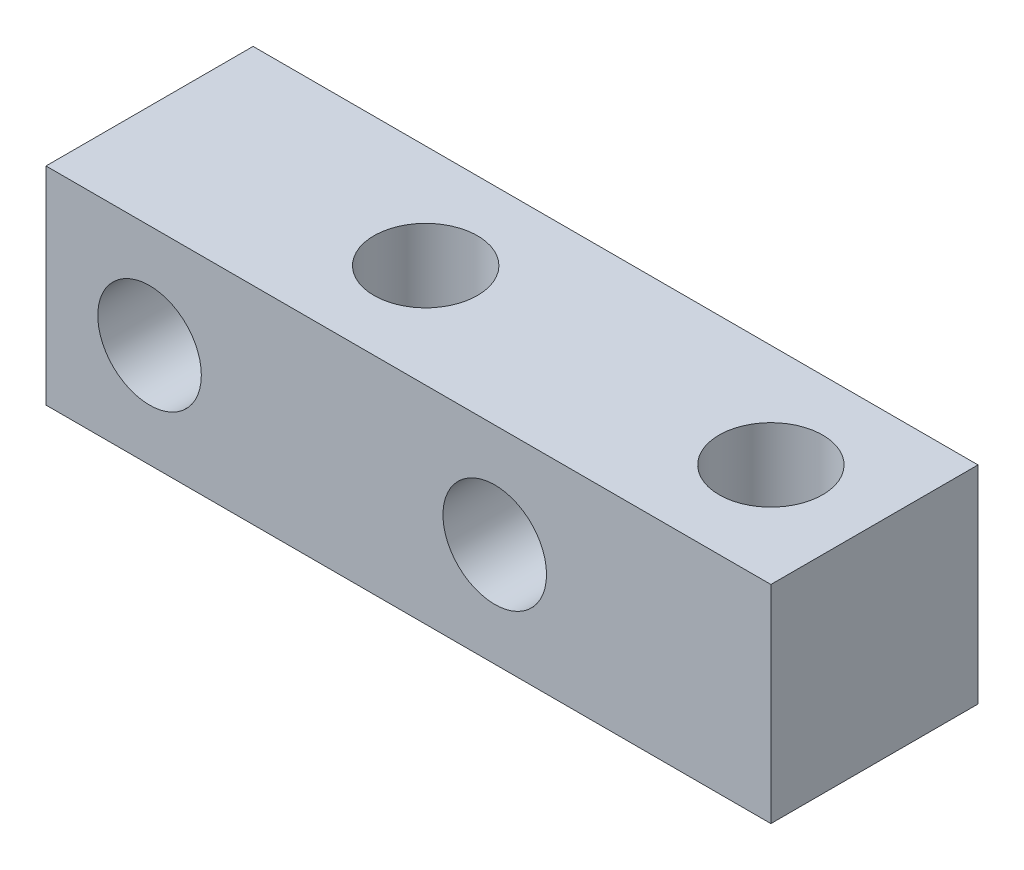
ISO-10303-21;
HEADER;
FILE_DESCRIPTION(('STEP AP214'),'2;1');
FILE_NAME('part.step','',(''),(''),'','','');
FILE_SCHEMA(('AUTOMOTIVE_DESIGN { 1 0 10303 214 1 1 1 1 }'));
ENDSEC;
DATA;
#1=APPLICATION_CONTEXT('core data for automotive mechanical design processes');
#2=APPLICATION_PROTOCOL_DEFINITION('international standard','automotive_design',2000,#1);
#3=PRODUCT_CONTEXT('',#1,'mechanical');
#4=PRODUCT('Part','Part','',(#3));
#5=PRODUCT_RELATED_PRODUCT_CATEGORY('part','',(#4));
#6=PRODUCT_DEFINITION_FORMATION('','',#4);
#7=PRODUCT_DEFINITION_CONTEXT('part definition',#1,'design');
#8=PRODUCT_DEFINITION('design','',#6,#7);
#9=PRODUCT_DEFINITION_SHAPE('','',#8);
#10=(LENGTH_UNIT() NAMED_UNIT(*) SI_UNIT(.MILLI.,.METRE.));
#11=(NAMED_UNIT(*) PLANE_ANGLE_UNIT() SI_UNIT($,.RADIAN.));
#12=(NAMED_UNIT(*) SI_UNIT($,.STERADIAN.) SOLID_ANGLE_UNIT());
#13=UNCERTAINTY_MEASURE_WITH_UNIT(LENGTH_MEASURE(1.E-05),#10,'distance_accuracy_value','');
#14=(GEOMETRIC_REPRESENTATION_CONTEXT(3) GLOBAL_UNCERTAINTY_ASSIGNED_CONTEXT((#13)) GLOBAL_UNIT_ASSIGNED_CONTEXT((#10,
#11,#12)) REPRESENTATION_CONTEXT('',''));
#15=CARTESIAN_POINT('',(0.,0.,0.));
#16=DIRECTION('',(0.,0.,1.));
#17=DIRECTION('',(1.,0.,0.));
#18=AXIS2_PLACEMENT_3D('',#15,#16,#17);
#19=CARTESIAN_POINT('',(10.5,3.,6.));
#20=DIRECTION('',(-1.,0.,0.));
#21=DIRECTION('',(0.,0.,1.));
#22=AXIS2_PLACEMENT_3D('',#19,#20,#21);
#23=PLANE('',#22);
#24=DIRECTION('',(0.,1.,0.));
#25=VECTOR('',#24,1.);
#26=CARTESIAN_POINT('',(10.5,3.,0.));
#27=LINE('',#26,#25);
#28=CARTESIAN_POINT('',(10.5,-3.,0.));
#29=VERTEX_POINT('',#28);
#30=CARTESIAN_POINT('',(10.5,3.,0.));
#31=VERTEX_POINT('',#30);
#32=EDGE_CURVE('E111',#29,#31,#27,.T.);
#33=ORIENTED_EDGE('',*,*,#32,.T.);
#34=DIRECTION('',(0.,0.,-1.));
#35=VECTOR('',#34,1.);
#36=CARTESIAN_POINT('',(10.5,3.,6.));
#37=LINE('',#36,#35);
#38=CARTESIAN_POINT('',(10.5,3.,6.));
#39=VERTEX_POINT('',#38);
#40=EDGE_CURVE('E11',#39,#31,#37,.T.);
#41=ORIENTED_EDGE('',*,*,#40,.F.);
#42=DIRECTION('',(0.,1.,0.));
#43=VECTOR('',#42,1.);
#44=CARTESIAN_POINT('',(10.5,3.,6.));
#45=LINE('',#44,#43);
#46=CARTESIAN_POINT('',(10.5,-3.,6.));
#47=VERTEX_POINT('',#46);
#48=EDGE_CURVE('E95',#47,#39,#45,.T.);
#49=ORIENTED_EDGE('',*,*,#48,.F.);
#50=DIRECTION('',(0.,0.,-1.));
#51=VECTOR('',#50,1.);
#52=CARTESIAN_POINT('',(10.5,-3.,6.));
#53=LINE('',#52,#51);
#54=EDGE_CURVE('E107',#47,#29,#53,.T.);
#55=ORIENTED_EDGE('',*,*,#54,.T.);
#56=EDGE_LOOP('',(#33,#41,#49,#55));
#57=FACE_BOUND('',#56,.T.);
#58=ADVANCED_FACE('F43',(#57),#23,.F.);
#59=CARTESIAN_POINT('',(-10.5,3.,6.));
#60=DIRECTION('',(0.,-1.,0.));
#61=DIRECTION('',(0.,0.,-1.));
#62=AXIS2_PLACEMENT_3D('',#59,#60,#61);
#63=PLANE('',#62);
#64=CARTESIAN_POINT('',(7.5,3.,3.));
#65=DIRECTION('',(0.,1.,0.));
#66=DIRECTION('',(0.,0.,1.));
#67=AXIS2_PLACEMENT_3D('',#64,#65,#66);
#68=CIRCLE('',#67,1.5);
#69=CARTESIAN_POINT('',(7.5,3.,4.5));
#70=VERTEX_POINT('',#69);
#71=EDGE_CURVE('E156',#70,#70,#68,.T.);
#72=ORIENTED_EDGE('',*,*,#71,.F.);
#73=EDGE_LOOP('',(#72));
#74=FACE_BOUND('',#73,.T.);
#75=CARTESIAN_POINT('',(-2.5,3.,3.));
#76=DIRECTION('',(0.,1.,0.));
#77=DIRECTION('',(0.,0.,1.));
#78=AXIS2_PLACEMENT_3D('',#75,#76,#77);
#79=CIRCLE('',#78,1.5);
#80=CARTESIAN_POINT('',(-2.5,3.,4.5));
#81=VERTEX_POINT('',#80);
#82=EDGE_CURVE('E152',#81,#81,#79,.T.);
#83=ORIENTED_EDGE('',*,*,#82,.F.);
#84=EDGE_LOOP('',(#83));
#85=FACE_BOUND('',#84,.T.);
#86=DIRECTION('',(-1.,0.,0.));
#87=VECTOR('',#86,1.);
#88=CARTESIAN_POINT('',(-10.5,3.,0.));
#89=LINE('',#88,#87);
#90=CARTESIAN_POINT('',(-10.5,3.,0.));
#91=VERTEX_POINT('',#90);
#92=EDGE_CURVE('E100',#31,#91,#89,.T.);
#93=ORIENTED_EDGE('',*,*,#92,.T.);
#94=DIRECTION('',(0.,0.,-1.));
#95=VECTOR('',#94,1.);
#96=CARTESIAN_POINT('',(-10.5,3.,6.));
#97=LINE('',#96,#95);
#98=CARTESIAN_POINT('',(-10.5,3.,6.));
#99=VERTEX_POINT('',#98);
#100=EDGE_CURVE('E52',#99,#91,#97,.T.);
#101=ORIENTED_EDGE('',*,*,#100,.F.);
#102=DIRECTION('',(-1.,0.,0.));
#103=VECTOR('',#102,1.);
#104=CARTESIAN_POINT('',(-10.5,3.,6.));
#105=LINE('',#104,#103);
#106=EDGE_CURVE('E90',#39,#99,#105,.T.);
#107=ORIENTED_EDGE('',*,*,#106,.F.);
#108=ORIENTED_EDGE('',*,*,#40,.T.);
#109=EDGE_LOOP('',(#93,#101,#107,#108));
#110=FACE_BOUND('',#109,.T.);
#111=ADVANCED_FACE('F99',(#74,#85,#110),#63,.F.);
#112=CARTESIAN_POINT('',(-10.5,3.,6.));
#113=DIRECTION('',(1.,0.,0.));
#114=DIRECTION('',(0.,0.,-1.));
#115=AXIS2_PLACEMENT_3D('',#112,#113,#114);
#116=PLANE('',#115);
#117=DIRECTION('',(0.,-1.,0.));
#118=VECTOR('',#117,1.);
#119=CARTESIAN_POINT('',(-10.5,3.,0.));
#120=LINE('',#119,#118);
#121=CARTESIAN_POINT('',(-10.5,-3.,0.));
#122=VERTEX_POINT('',#121);
#123=EDGE_CURVE('E77',#91,#122,#120,.T.);
#124=ORIENTED_EDGE('',*,*,#123,.T.);
#125=DIRECTION('',(0.,0.,-1.));
#126=VECTOR('',#125,1.);
#127=CARTESIAN_POINT('',(-10.5,-3.,6.));
#128=LINE('',#127,#126);
#129=CARTESIAN_POINT('',(-10.5,-3.,6.));
#130=VERTEX_POINT('',#129);
#131=EDGE_CURVE('E102',#130,#122,#128,.T.);
#132=ORIENTED_EDGE('',*,*,#131,.F.);
#133=DIRECTION('',(0.,-1.,0.));
#134=VECTOR('',#133,1.);
#135=CARTESIAN_POINT('',(-10.5,3.,6.));
#136=LINE('',#135,#134);
#137=EDGE_CURVE('E93',#99,#130,#136,.T.);
#138=ORIENTED_EDGE('',*,*,#137,.F.);
#139=ORIENTED_EDGE('',*,*,#100,.T.);
#140=EDGE_LOOP('',(#124,#132,#138,#139));
#141=FACE_BOUND('',#140,.T.);
#142=ADVANCED_FACE('F103',(#141),#116,.F.);
#143=CARTESIAN_POINT('',(-10.5,-3.,6.));
#144=DIRECTION('',(0.,1.,0.));
#145=DIRECTION('',(0.,0.,1.));
#146=AXIS2_PLACEMENT_3D('',#143,#144,#145);
#147=PLANE('',#146);
#148=CARTESIAN_POINT('',(7.5,-3.,3.));
#149=DIRECTION('',(0.,1.,0.));
#150=DIRECTION('',(0.,0.,1.));
#151=AXIS2_PLACEMENT_3D('',#148,#149,#150);
#152=CIRCLE('',#151,1.5);
#153=CARTESIAN_POINT('',(7.5,-3.,4.5));
#154=VERTEX_POINT('',#153);
#155=EDGE_CURVE('E137',#154,#154,#152,.T.);
#156=ORIENTED_EDGE('',*,*,#155,.T.);
#157=EDGE_LOOP('',(#156));
#158=FACE_BOUND('',#157,.T.);
#159=CARTESIAN_POINT('',(-2.5,-3.,3.));
#160=DIRECTION('',(0.,1.,0.));
#161=DIRECTION('',(0.,0.,1.));
#162=AXIS2_PLACEMENT_3D('',#159,#160,#161);
#163=CIRCLE('',#162,1.5);
#164=CARTESIAN_POINT('',(-2.5,-3.,4.5));
#165=VERTEX_POINT('',#164);
#166=EDGE_CURVE('E148',#165,#165,#163,.T.);
#167=ORIENTED_EDGE('',*,*,#166,.T.);
#168=EDGE_LOOP('',(#167));
#169=FACE_BOUND('',#168,.T.);
#170=DIRECTION('',(1.,0.,0.));
#171=VECTOR('',#170,1.);
#172=CARTESIAN_POINT('',(-10.5,-3.,0.));
#173=LINE('',#172,#171);
#174=EDGE_CURVE('E83',#122,#29,#173,.T.);
#175=ORIENTED_EDGE('',*,*,#174,.T.);
#176=ORIENTED_EDGE('',*,*,#54,.F.);
#177=DIRECTION('',(1.,0.,0.));
#178=VECTOR('',#177,1.);
#179=CARTESIAN_POINT('',(-10.5,-3.,6.));
#180=LINE('',#179,#178);
#181=EDGE_CURVE('E60',#130,#47,#180,.T.);
#182=ORIENTED_EDGE('',*,*,#181,.F.);
#183=ORIENTED_EDGE('',*,*,#131,.T.);
#184=EDGE_LOOP('',(#175,#176,#182,#183));
#185=FACE_BOUND('',#184,.T.);
#186=ADVANCED_FACE('F125',(#158,#169,#185),#147,.F.);
#187=CARTESIAN_POINT('',(0.,0.,6.));
#188=DIRECTION('',(0.,0.,1.));
#189=DIRECTION('',(1.,0.,0.));
#190=AXIS2_PLACEMENT_3D('',#187,#188,#189);
#191=PLANE('',#190);
#192=CARTESIAN_POINT('',(-7.5,0.,6.));
#193=DIRECTION('',(0.,0.,1.));
#194=DIRECTION('',(1.,0.,0.));
#195=AXIS2_PLACEMENT_3D('',#192,#193,#194);
#196=CIRCLE('',#195,1.5);
#197=CARTESIAN_POINT('',(-6.,0.,6.));
#198=VERTEX_POINT('',#197);
#199=EDGE_CURVE('E141',#198,#198,#196,.T.);
#200=ORIENTED_EDGE('',*,*,#199,.F.);
#201=EDGE_LOOP('',(#200));
#202=FACE_BOUND('',#201,.T.);
#203=CARTESIAN_POINT('',(2.5,0.,6.));
#204=DIRECTION('',(0.,0.,1.));
#205=DIRECTION('',(1.,0.,0.));
#206=AXIS2_PLACEMENT_3D('',#203,#204,#205);
#207=CIRCLE('',#206,1.5);
#208=CARTESIAN_POINT('',(4.,0.,6.));
#209=VERTEX_POINT('',#208);
#210=EDGE_CURVE('E136',#209,#209,#207,.T.);
#211=ORIENTED_EDGE('',*,*,#210,.F.);
#212=EDGE_LOOP('',(#211));
#213=FACE_BOUND('',#212,.T.);
#214=ORIENTED_EDGE('',*,*,#48,.T.);
#215=ORIENTED_EDGE('',*,*,#106,.T.);
#216=ORIENTED_EDGE('',*,*,#137,.T.);
#217=ORIENTED_EDGE('',*,*,#181,.T.);
#218=EDGE_LOOP('',(#214,#215,#216,#217));
#219=FACE_BOUND('',#218,.T.);
#220=ADVANCED_FACE('F91',(#202,#213,#219),#191,.T.);
#221=CARTESIAN_POINT('',(0.,0.,0.));
#222=DIRECTION('',(0.,0.,1.));
#223=DIRECTION('',(1.,0.,0.));
#224=AXIS2_PLACEMENT_3D('',#221,#222,#223);
#225=PLANE('',#224);
#226=CARTESIAN_POINT('',(-7.5,0.,0.));
#227=DIRECTION('',(0.,0.,1.));
#228=DIRECTION('',(1.,0.,0.));
#229=AXIS2_PLACEMENT_3D('',#226,#227,#228);
#230=CIRCLE('',#229,1.5);
#231=CARTESIAN_POINT('',(-6.,0.,0.));
#232=VERTEX_POINT('',#231);
#233=EDGE_CURVE('E115',#232,#232,#230,.T.);
#234=ORIENTED_EDGE('',*,*,#233,.T.);
#235=EDGE_LOOP('',(#234));
#236=FACE_BOUND('',#235,.T.);
#237=CARTESIAN_POINT('',(2.5,0.,0.));
#238=DIRECTION('',(0.,0.,1.));
#239=DIRECTION('',(1.,0.,0.));
#240=AXIS2_PLACEMENT_3D('',#237,#238,#239);
#241=CIRCLE('',#240,1.5);
#242=CARTESIAN_POINT('',(4.,0.,0.));
#243=VERTEX_POINT('',#242);
#244=EDGE_CURVE('E132',#243,#243,#241,.T.);
#245=ORIENTED_EDGE('',*,*,#244,.T.);
#246=EDGE_LOOP('',(#245));
#247=FACE_BOUND('',#246,.T.);
#248=ORIENTED_EDGE('',*,*,#32,.F.);
#249=ORIENTED_EDGE('',*,*,#174,.F.);
#250=ORIENTED_EDGE('',*,*,#123,.F.);
#251=ORIENTED_EDGE('',*,*,#92,.F.);
#252=EDGE_LOOP('',(#248,#249,#250,#251));
#253=FACE_BOUND('',#252,.T.);
#254=ADVANCED_FACE('F128',(#236,#247,#253),#225,.F.);
#255=CARTESIAN_POINT('',(2.5,0.,0.));
#256=DIRECTION('',(0.,0.,1.));
#257=DIRECTION('',(1.,0.,0.));
#258=AXIS2_PLACEMENT_3D('',#255,#256,#257);
#259=CYLINDRICAL_SURFACE('',#258,1.5);
#260=ORIENTED_EDGE('',*,*,#244,.F.);
#261=EDGE_LOOP('',(#260));
#262=FACE_BOUND('',#261,.T.);
#263=ORIENTED_EDGE('',*,*,#210,.T.);
#264=EDGE_LOOP('',(#263));
#265=FACE_BOUND('',#264,.T.);
#266=ADVANCED_FACE('F184',(#262,#265),#259,.F.);
#267=CARTESIAN_POINT('',(-7.5,0.,0.));
#268=DIRECTION('',(0.,0.,1.));
#269=DIRECTION('',(1.,0.,0.));
#270=AXIS2_PLACEMENT_3D('',#267,#268,#269);
#271=CYLINDRICAL_SURFACE('',#270,1.5);
#272=ORIENTED_EDGE('',*,*,#233,.F.);
#273=EDGE_LOOP('',(#272));
#274=FACE_BOUND('',#273,.T.);
#275=ORIENTED_EDGE('',*,*,#199,.T.);
#276=EDGE_LOOP('',(#275));
#277=FACE_BOUND('',#276,.T.);
#278=ADVANCED_FACE('F178',(#274,#277),#271,.F.);
#279=CARTESIAN_POINT('',(-2.5,-3.,3.));
#280=DIRECTION('',(0.,1.,0.));
#281=DIRECTION('',(0.,0.,1.));
#282=AXIS2_PLACEMENT_3D('',#279,#280,#281);
#283=CYLINDRICAL_SURFACE('',#282,1.5);
#284=ORIENTED_EDGE('',*,*,#166,.F.);
#285=EDGE_LOOP('',(#284));
#286=FACE_BOUND('',#285,.T.);
#287=ORIENTED_EDGE('',*,*,#82,.T.);
#288=EDGE_LOOP('',(#287));
#289=FACE_BOUND('',#288,.T.);
#290=ADVANCED_FACE('F169',(#286,#289),#283,.F.);
#291=CARTESIAN_POINT('',(7.5,-3.,3.));
#292=DIRECTION('',(0.,1.,0.));
#293=DIRECTION('',(0.,0.,1.));
#294=AXIS2_PLACEMENT_3D('',#291,#292,#293);
#295=CYLINDRICAL_SURFACE('',#294,1.5);
#296=ORIENTED_EDGE('',*,*,#155,.F.);
#297=EDGE_LOOP('',(#296));
#298=FACE_BOUND('',#297,.T.);
#299=ORIENTED_EDGE('',*,*,#71,.T.);
#300=EDGE_LOOP('',(#299));
#301=FACE_BOUND('',#300,.T.);
#302=ADVANCED_FACE('F166',(#298,#301),#295,.F.);
#303=CLOSED_SHELL('',(#58,#111,#142,#186,#220,#254,#266,#278,#290,#302));
#304=MANIFOLD_SOLID_BREP('B2',#303);
#305=ADVANCED_BREP_SHAPE_REPRESENTATION('',(#18,#304),#14);
#306=SHAPE_DEFINITION_REPRESENTATION(#9,#305);
ENDSEC;
END-ISO-10303-21;
